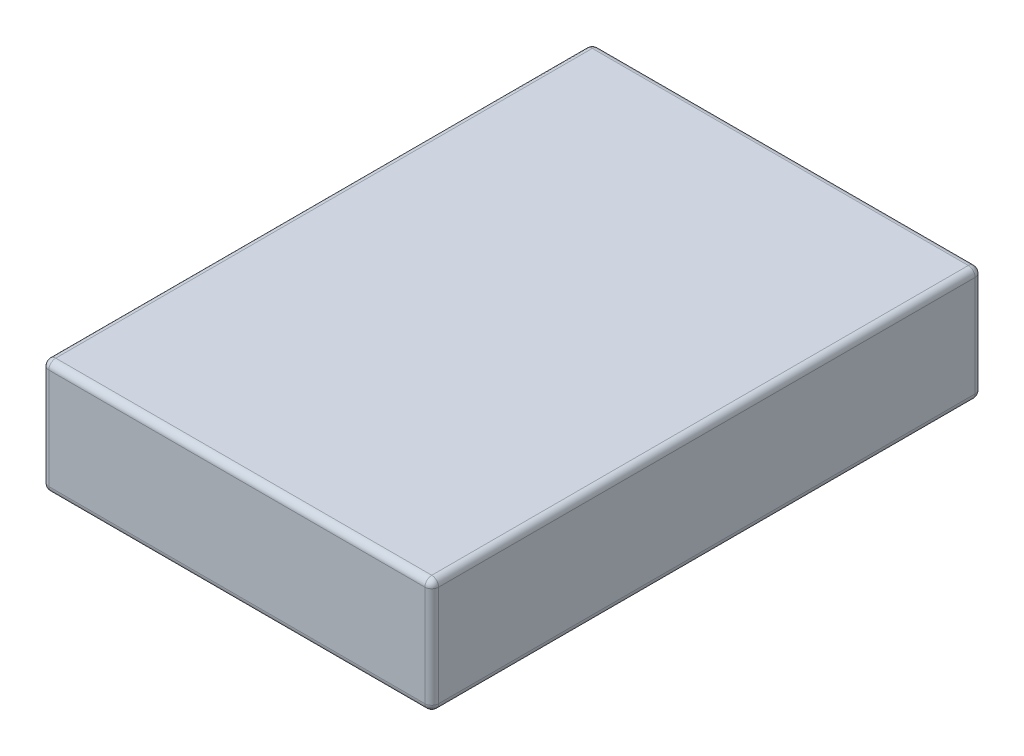
ISO-10303-21;
HEADER;
FILE_DESCRIPTION(('STEP AP214'),'2;1');
FILE_NAME('part.step','',(''),(''),'','','');
FILE_SCHEMA(('AUTOMOTIVE_DESIGN { 1 0 10303 214 1 1 1 1 }'));
ENDSEC;
DATA;
#1=APPLICATION_CONTEXT('core data for automotive mechanical design processes');
#2=APPLICATION_PROTOCOL_DEFINITION('international standard','automotive_design',2000,#1);
#3=PRODUCT_CONTEXT('',#1,'mechanical');
#4=PRODUCT('Part','Part','',(#3));
#5=PRODUCT_RELATED_PRODUCT_CATEGORY('part','',(#4));
#6=PRODUCT_DEFINITION_FORMATION('','',#4);
#7=PRODUCT_DEFINITION_CONTEXT('part definition',#1,'design');
#8=PRODUCT_DEFINITION('design','',#6,#7);
#9=PRODUCT_DEFINITION_SHAPE('','',#8);
#10=(LENGTH_UNIT() NAMED_UNIT(*) SI_UNIT(.MILLI.,.METRE.));
#11=(NAMED_UNIT(*) PLANE_ANGLE_UNIT() SI_UNIT($,.RADIAN.));
#12=(NAMED_UNIT(*) SI_UNIT($,.STERADIAN.) SOLID_ANGLE_UNIT());
#13=UNCERTAINTY_MEASURE_WITH_UNIT(LENGTH_MEASURE(1.E-05),#10,'distance_accuracy_value','');
#14=(GEOMETRIC_REPRESENTATION_CONTEXT(3) GLOBAL_UNCERTAINTY_ASSIGNED_CONTEXT((#13)) GLOBAL_UNIT_ASSIGNED_CONTEXT((#10,
#11,#12)) REPRESENTATION_CONTEXT('',''));
#15=CARTESIAN_POINT('',(0.,0.,0.));
#16=DIRECTION('',(0.,0.,1.));
#17=DIRECTION('',(1.,0.,0.));
#18=AXIS2_PLACEMENT_3D('',#15,#16,#17);
#19=CARTESIAN_POINT('',(16.4,-4.4,-23.4));
#20=DIRECTION('',(0.,-0.707106781186548,-0.707106781186548));
#21=DIRECTION('',(1.,0.,0.));
#22=AXIS2_PLACEMENT_3D('',#19,#20,#21);
#23=SPHERICAL_SURFACE('',#22,0.6);
#24=CARTESIAN_POINT('',(16.4,-4.4,-23.4));
#25=DIRECTION('',(0.,-1.,0.));
#26=DIRECTION('',(0.,0.,-1.));
#27=AXIS2_PLACEMENT_3D('',#24,#25,#26);
#28=CIRCLE('',#27,0.6);
#29=CARTESIAN_POINT('',(17.,-4.4,-23.4));
#30=VERTEX_POINT('',#29);
#31=CARTESIAN_POINT('',(16.4,-4.4,-24.));
#32=VERTEX_POINT('',#31);
#33=EDGE_CURVE('E59',#30,#32,#28,.F.);
#34=ORIENTED_EDGE('',*,*,#33,.F.);
#35=CARTESIAN_POINT('',(16.4,-4.4,-23.4));
#36=DIRECTION('',(0.,0.,-1.));
#37=DIRECTION('',(-1.,0.,0.));
#38=AXIS2_PLACEMENT_3D('',#35,#36,#37);
#39=CIRCLE('',#38,0.6);
#40=CARTESIAN_POINT('',(16.4,-5.,-23.4));
#41=VERTEX_POINT('',#40);
#42=EDGE_CURVE('E19',#41,#30,#39,.F.);
#43=ORIENTED_EDGE('',*,*,#42,.F.);
#44=CARTESIAN_POINT('',(16.4,-4.4,-23.4));
#45=DIRECTION('',(-1.,0.,0.));
#46=DIRECTION('',(0.,0.,1.));
#47=AXIS2_PLACEMENT_3D('',#44,#45,#46);
#48=CIRCLE('',#47,0.6);
#49=CARTESIAN_POINT('',(16.4,-4.82426406871193,-23.8242640687119));
#50=VERTEX_POINT('',#49);
#51=EDGE_CURVE('E34',#50,#41,#48,.T.);
#52=ORIENTED_EDGE('',*,*,#51,.F.);
#53=CARTESIAN_POINT('',(16.4,-4.4,-23.4));
#54=DIRECTION('',(-1.,0.,0.));
#55=DIRECTION('',(0.,0.,1.));
#56=AXIS2_PLACEMENT_3D('',#53,#54,#55);
#57=CIRCLE('',#56,0.6);
#58=EDGE_CURVE('E72',#32,#50,#57,.T.);
#59=ORIENTED_EDGE('',*,*,#58,.F.);
#60=EDGE_LOOP('',(#34,#43,#52,#59));
#61=FACE_BOUND('',#60,.T.);
#62=ADVANCED_FACE('F15',(#61),#23,.T.);
#63=CARTESIAN_POINT('',(-16.4,-4.4,-23.4));
#64=DIRECTION('',(-0.707106781186548,0.,-0.707106781186548));
#65=DIRECTION('',(0.,-1.,0.));
#66=AXIS2_PLACEMENT_3D('',#63,#64,#65);
#67=SPHERICAL_SURFACE('',#66,0.6);
#68=CARTESIAN_POINT('',(-16.4,-4.4,-23.4));
#69=DIRECTION('',(0.,1.,0.));
#70=DIRECTION('',(0.,0.,1.));
#71=AXIS2_PLACEMENT_3D('',#68,#69,#70);
#72=CIRCLE('',#71,0.6);
#73=CARTESIAN_POINT('',(-16.8242640687119,-4.4,-23.8242640687119));
#74=VERTEX_POINT('',#73);
#75=CARTESIAN_POINT('',(-17.,-4.4,-23.4));
#76=VERTEX_POINT('',#75);
#77=EDGE_CURVE('E163',#74,#76,#72,.T.);
#78=ORIENTED_EDGE('',*,*,#77,.F.);
#79=CARTESIAN_POINT('',(-16.4,-4.4,-23.4));
#80=DIRECTION('',(0.,1.,0.));
#81=DIRECTION('',(0.,0.,1.));
#82=AXIS2_PLACEMENT_3D('',#79,#80,#81);
#83=CIRCLE('',#82,0.6);
#84=CARTESIAN_POINT('',(-16.4,-4.4,-24.));
#85=VERTEX_POINT('',#84);
#86=EDGE_CURVE('E166',#85,#74,#83,.T.);
#87=ORIENTED_EDGE('',*,*,#86,.F.);
#88=CARTESIAN_POINT('',(-16.4,-4.4,-23.4));
#89=DIRECTION('',(-1.,0.,0.));
#90=DIRECTION('',(0.,0.,1.));
#91=AXIS2_PLACEMENT_3D('',#88,#89,#90);
#92=CIRCLE('',#91,0.6);
#93=CARTESIAN_POINT('',(-16.4,-5.,-23.4));
#94=VERTEX_POINT('',#93);
#95=EDGE_CURVE('E85',#94,#85,#92,.F.);
#96=ORIENTED_EDGE('',*,*,#95,.F.);
#97=CARTESIAN_POINT('',(-16.4,-4.4,-23.4));
#98=DIRECTION('',(0.,0.,-1.));
#99=DIRECTION('',(-1.,0.,0.));
#100=AXIS2_PLACEMENT_3D('',#97,#98,#99);
#101=CIRCLE('',#100,0.6);
#102=EDGE_CURVE('E160',#76,#94,#101,.F.);
#103=ORIENTED_EDGE('',*,*,#102,.F.);
#104=EDGE_LOOP('',(#78,#87,#96,#103));
#105=FACE_BOUND('',#104,.T.);
#106=ADVANCED_FACE('F332',(#105),#67,.T.);
#107=CARTESIAN_POINT('',(-16.4,-4.4,23.4));
#108=DIRECTION('',(-0.707106781186548,0.,0.707106781186548));
#109=DIRECTION('',(0.,-1.,0.));
#110=AXIS2_PLACEMENT_3D('',#107,#108,#109);
#111=SPHERICAL_SURFACE('',#110,0.6);
#112=CARTESIAN_POINT('',(-16.4,-4.4,23.4));
#113=DIRECTION('',(0.,0.,-1.));
#114=DIRECTION('',(-1.,0.,0.));
#115=AXIS2_PLACEMENT_3D('',#112,#113,#114);
#116=CIRCLE('',#115,0.6);
#117=CARTESIAN_POINT('',(-16.4,-5.,23.4));
#118=VERTEX_POINT('',#117);
#119=CARTESIAN_POINT('',(-17.,-4.4,23.4));
#120=VERTEX_POINT('',#119);
#121=EDGE_CURVE('E157',#118,#120,#116,.T.);
#122=ORIENTED_EDGE('',*,*,#121,.F.);
#123=CARTESIAN_POINT('',(-16.4,-4.4,23.4));
#124=DIRECTION('',(1.,0.,0.));
#125=DIRECTION('',(0.,0.,-1.));
#126=AXIS2_PLACEMENT_3D('',#123,#124,#125);
#127=CIRCLE('',#126,0.6);
#128=CARTESIAN_POINT('',(-16.4,-4.4,24.));
#129=VERTEX_POINT('',#128);
#130=EDGE_CURVE('E149',#129,#118,#127,.T.);
#131=ORIENTED_EDGE('',*,*,#130,.F.);
#132=CARTESIAN_POINT('',(-16.4,-4.4,23.4));
#133=DIRECTION('',(0.,-1.,0.));
#134=DIRECTION('',(0.,0.,-1.));
#135=AXIS2_PLACEMENT_3D('',#132,#133,#134);
#136=CIRCLE('',#135,0.6);
#137=CARTESIAN_POINT('',(-16.8242640687119,-4.4,23.8242640687119));
#138=VERTEX_POINT('',#137);
#139=EDGE_CURVE('E153',#138,#129,#136,.F.);
#140=ORIENTED_EDGE('',*,*,#139,.F.);
#141=CARTESIAN_POINT('',(-16.4,-4.4,23.4));
#142=DIRECTION('',(0.,-1.,0.));
#143=DIRECTION('',(0.,0.,-1.));
#144=AXIS2_PLACEMENT_3D('',#141,#142,#143);
#145=CIRCLE('',#144,0.6);
#146=EDGE_CURVE('E156',#120,#138,#145,.F.);
#147=ORIENTED_EDGE('',*,*,#146,.F.);
#148=EDGE_LOOP('',(#122,#131,#140,#147));
#149=FACE_BOUND('',#148,.T.);
#150=ADVANCED_FACE('F495',(#149),#111,.T.);
#151=CARTESIAN_POINT('',(-17.,-5.,-24.));
#152=DIRECTION('',(0.,-1.,0.));
#153=DIRECTION('',(0.,0.,-1.));
#154=AXIS2_PLACEMENT_3D('',#151,#152,#153);
#155=PLANE('',#154);
#156=DIRECTION('',(1.,0.,0.));
#157=VECTOR('',#156,1.);
#158=CARTESIAN_POINT('',(-17.09174313838,-5.,23.4));
#159=LINE('',#158,#157);
#160=CARTESIAN_POINT('',(16.4,-5.,23.4));
#161=VERTEX_POINT('',#160);
#162=EDGE_CURVE('E152',#118,#161,#159,.T.);
#163=ORIENTED_EDGE('',*,*,#162,.F.);
#164=DIRECTION('',(0.,0.,-1.));
#165=VECTOR('',#164,1.);
#166=CARTESIAN_POINT('',(-16.4,-5.,24.09336120841));
#167=LINE('',#166,#165);
#168=EDGE_CURVE('E81',#94,#118,#167,.F.);
#169=ORIENTED_EDGE('',*,*,#168,.F.);
#170=DIRECTION('',(-1.,0.,0.));
#171=VECTOR('',#170,1.);
#172=CARTESIAN_POINT('',(17.08821345466,-5.,-23.4));
#173=LINE('',#172,#171);
#174=EDGE_CURVE('E70',#41,#94,#173,.T.);
#175=ORIENTED_EDGE('',*,*,#174,.F.);
#176=DIRECTION('',(0.,0.,-1.));
#177=VECTOR('',#176,1.);
#178=CARTESIAN_POINT('',(16.4,-5.,24.09336120841));
#179=LINE('',#178,#177);
#180=EDGE_CURVE('E78',#161,#41,#179,.T.);
#181=ORIENTED_EDGE('',*,*,#180,.F.);
#182=EDGE_LOOP('',(#163,#169,#175,#181));
#183=FACE_BOUND('',#182,.T.);
#184=ADVANCED_FACE('F77',(#183),#155,.T.);
#185=CARTESIAN_POINT('',(16.4,-4.4,23.4));
#186=DIRECTION('',(0.,-0.707106781186548,0.707106781186548));
#187=DIRECTION('',(1.,0.,0.));
#188=AXIS2_PLACEMENT_3D('',#185,#186,#187);
#189=SPHERICAL_SURFACE('',#188,0.6);
#190=CARTESIAN_POINT('',(16.4,-4.4,23.4));
#191=DIRECTION('',(1.,0.,0.));
#192=DIRECTION('',(0.,0.,-1.));
#193=AXIS2_PLACEMENT_3D('',#190,#191,#192);
#194=CIRCLE('',#193,0.6);
#195=CARTESIAN_POINT('',(16.4,-4.82426406871193,23.8242640687119));
#196=VERTEX_POINT('',#195);
#197=EDGE_CURVE('E148',#161,#196,#194,.F.);
#198=ORIENTED_EDGE('',*,*,#197,.F.);
#199=CARTESIAN_POINT('',(16.4,-4.4,23.4));
#200=DIRECTION('',(0.,0.,-1.));
#201=DIRECTION('',(-1.,0.,0.));
#202=AXIS2_PLACEMENT_3D('',#199,#200,#201);
#203=CIRCLE('',#202,0.6);
#204=CARTESIAN_POINT('',(17.,-4.4,23.4));
#205=VERTEX_POINT('',#204);
#206=EDGE_CURVE('E64',#205,#161,#203,.T.);
#207=ORIENTED_EDGE('',*,*,#206,.F.);
#208=CARTESIAN_POINT('',(16.4,-4.4,23.4));
#209=DIRECTION('',(0.,1.,0.));
#210=DIRECTION('',(0.,0.,1.));
#211=AXIS2_PLACEMENT_3D('',#208,#209,#210);
#212=CIRCLE('',#211,0.6);
#213=CARTESIAN_POINT('',(16.4,-4.4,24.));
#214=VERTEX_POINT('',#213);
#215=EDGE_CURVE('E138',#214,#205,#212,.T.);
#216=ORIENTED_EDGE('',*,*,#215,.F.);
#217=CARTESIAN_POINT('',(16.4,-4.4,23.4));
#218=DIRECTION('',(1.,0.,0.));
#219=DIRECTION('',(0.,0.,-1.));
#220=AXIS2_PLACEMENT_3D('',#217,#218,#219);
#221=CIRCLE('',#220,0.6);
#222=EDGE_CURVE('E145',#196,#214,#221,.F.);
#223=ORIENTED_EDGE('',*,*,#222,.F.);
#224=EDGE_LOOP('',(#198,#207,#216,#223));
#225=FACE_BOUND('',#224,.T.);
#226=ADVANCED_FACE('F309',(#225),#189,.T.);
#227=CARTESIAN_POINT('',(16.4,-4.4,24.09336120841));
#228=DIRECTION('',(0.,0.,-1.));
#229=DIRECTION('',(-1.,0.,0.));
#230=AXIS2_PLACEMENT_3D('',#227,#228,#229);
#231=CYLINDRICAL_SURFACE('',#230,0.6);
#232=ORIENTED_EDGE('',*,*,#206,.T.);
#233=ORIENTED_EDGE('',*,*,#180,.T.);
#234=ORIENTED_EDGE('',*,*,#42,.T.);
#235=DIRECTION('',(0.,0.,-1.));
#236=VECTOR('',#235,1.);
#237=CARTESIAN_POINT('',(17.,-4.4,-24.));
#238=LINE('',#237,#236);
#239=EDGE_CURVE('E141',#205,#30,#238,.T.);
#240=ORIENTED_EDGE('',*,*,#239,.F.);
#241=EDGE_LOOP('',(#232,#233,#234,#240));
#242=FACE_BOUND('',#241,.T.);
#243=ADVANCED_FACE('F84',(#242),#231,.T.);
#244=CARTESIAN_POINT('',(17.08821345466,-4.4,-23.4));
#245=DIRECTION('',(-1.,0.,0.));
#246=DIRECTION('',(0.,0.,1.));
#247=AXIS2_PLACEMENT_3D('',#244,#245,#246);
#248=CYLINDRICAL_SURFACE('',#247,0.6);
#249=ORIENTED_EDGE('',*,*,#51,.T.);
#250=ORIENTED_EDGE('',*,*,#174,.T.);
#251=ORIENTED_EDGE('',*,*,#95,.T.);
#252=DIRECTION('',(1.,0.,0.));
#253=VECTOR('',#252,1.);
#254=CARTESIAN_POINT('',(0.,-4.4,-24.));
#255=LINE('',#254,#253);
#256=EDGE_CURVE('E180',#85,#32,#255,.T.);
#257=ORIENTED_EDGE('',*,*,#256,.T.);
#258=ORIENTED_EDGE('',*,*,#58,.T.);
#259=EDGE_LOOP('',(#249,#250,#251,#257,#258));
#260=FACE_BOUND('',#259,.T.);
#261=ADVANCED_FACE('F68',(#260),#248,.T.);
#262=CARTESIAN_POINT('',(16.4,5.093361208408,-23.4));
#263=DIRECTION('',(0.,-1.,0.));
#264=DIRECTION('',(0.,0.,-1.));
#265=AXIS2_PLACEMENT_3D('',#262,#263,#264);
#266=CYLINDRICAL_SURFACE('',#265,0.6);
#267=ORIENTED_EDGE('',*,*,#33,.T.);
#268=DIRECTION('',(0.,1.,0.));
#269=VECTOR('',#268,1.);
#270=CARTESIAN_POINT('',(16.4,0.,-24.));
#271=LINE('',#270,#269);
#272=CARTESIAN_POINT('',(16.4,4.4,-24.));
#273=VERTEX_POINT('',#272);
#274=EDGE_CURVE('E132',#32,#273,#271,.T.);
#275=ORIENTED_EDGE('',*,*,#274,.T.);
#276=CARTESIAN_POINT('',(16.4,4.4,-23.4));
#277=DIRECTION('',(0.,-1.,0.));
#278=DIRECTION('',(0.,0.,-1.));
#279=AXIS2_PLACEMENT_3D('',#276,#277,#278);
#280=CIRCLE('',#279,0.6);
#281=CARTESIAN_POINT('',(17.,4.4,-23.4));
#282=VERTEX_POINT('',#281);
#283=EDGE_CURVE('E133',#282,#273,#280,.F.);
#284=ORIENTED_EDGE('',*,*,#283,.F.);
#285=DIRECTION('',(0.,1.,0.));
#286=VECTOR('',#285,1.);
#287=CARTESIAN_POINT('',(17.,-5.,-23.4));
#288=LINE('',#287,#286);
#289=EDGE_CURVE('E185',#30,#282,#288,.T.);
#290=ORIENTED_EDGE('',*,*,#289,.F.);
#291=EDGE_LOOP('',(#267,#275,#284,#290));
#292=FACE_BOUND('',#291,.T.);
#293=ADVANCED_FACE('F336',(#292),#266,.T.);
#294=CARTESIAN_POINT('',(-16.4,-5.089974716722,-23.4));
#295=DIRECTION('',(0.,1.,0.));
#296=DIRECTION('',(0.,0.,1.));
#297=AXIS2_PLACEMENT_3D('',#294,#295,#296);
#298=CYLINDRICAL_SURFACE('',#297,0.6);
#299=ORIENTED_EDGE('',*,*,#77,.T.);
#300=DIRECTION('',(0.,1.,0.));
#301=VECTOR('',#300,1.);
#302=CARTESIAN_POINT('',(-17.,5.,-23.4));
#303=LINE('',#302,#301);
#304=CARTESIAN_POINT('',(-17.,4.4,-23.4));
#305=VERTEX_POINT('',#304);
#306=EDGE_CURVE('E179',#305,#76,#303,.F.);
#307=ORIENTED_EDGE('',*,*,#306,.F.);
#308=CARTESIAN_POINT('',(-16.4,4.4,-23.4));
#309=DIRECTION('',(0.,1.,0.));
#310=DIRECTION('',(0.,0.,1.));
#311=AXIS2_PLACEMENT_3D('',#308,#309,#310);
#312=CIRCLE('',#311,0.6);
#313=CARTESIAN_POINT('',(-16.4,4.4,-24.));
#314=VERTEX_POINT('',#313);
#315=EDGE_CURVE('E128',#314,#305,#312,.T.);
#316=ORIENTED_EDGE('',*,*,#315,.F.);
#317=DIRECTION('',(0.,1.,0.));
#318=VECTOR('',#317,1.);
#319=CARTESIAN_POINT('',(-16.4,0.,-24.));
#320=LINE('',#319,#318);
#321=EDGE_CURVE('E136',#314,#85,#320,.F.);
#322=ORIENTED_EDGE('',*,*,#321,.T.);
#323=ORIENTED_EDGE('',*,*,#86,.T.);
#324=EDGE_LOOP('',(#299,#307,#316,#322,#323));
#325=FACE_BOUND('',#324,.T.);
#326=ADVANCED_FACE('F331',(#325),#298,.T.);
#327=CARTESIAN_POINT('',(-16.4,-4.4,24.09336120841));
#328=DIRECTION('',(0.,0.,-1.));
#329=DIRECTION('',(-1.,0.,0.));
#330=AXIS2_PLACEMENT_3D('',#327,#328,#329);
#331=CYLINDRICAL_SURFACE('',#330,0.6);
#332=ORIENTED_EDGE('',*,*,#121,.T.);
#333=DIRECTION('',(0.,0.,1.));
#334=VECTOR('',#333,1.);
#335=CARTESIAN_POINT('',(-17.,-4.4,-24.));
#336=LINE('',#335,#334);
#337=EDGE_CURVE('E127',#76,#120,#336,.T.);
#338=ORIENTED_EDGE('',*,*,#337,.F.);
#339=ORIENTED_EDGE('',*,*,#102,.T.);
#340=ORIENTED_EDGE('',*,*,#168,.T.);
#341=EDGE_LOOP('',(#332,#338,#339,#340));
#342=FACE_BOUND('',#341,.T.);
#343=ADVANCED_FACE('F187',(#342),#331,.T.);
#344=CARTESIAN_POINT('',(-16.4,5.091743138385,23.4));
#345=DIRECTION('',(0.,-1.,0.));
#346=DIRECTION('',(0.,0.,-1.));
#347=AXIS2_PLACEMENT_3D('',#344,#345,#346);
#348=CYLINDRICAL_SURFACE('',#347,0.6);
#349=ORIENTED_EDGE('',*,*,#139,.T.);
#350=DIRECTION('',(0.,1.,0.));
#351=VECTOR('',#350,1.);
#352=CARTESIAN_POINT('',(-16.4,0.,24.));
#353=LINE('',#352,#351);
#354=CARTESIAN_POINT('',(-16.4,4.4,24.));
#355=VERTEX_POINT('',#354);
#356=EDGE_CURVE('E126',#355,#129,#353,.F.);
#357=ORIENTED_EDGE('',*,*,#356,.F.);
#358=CARTESIAN_POINT('',(-16.4,4.4,23.4));
#359=DIRECTION('',(0.,-1.,0.));
#360=DIRECTION('',(0.,0.,-1.));
#361=AXIS2_PLACEMENT_3D('',#358,#359,#360);
#362=CIRCLE('',#361,0.6);
#363=CARTESIAN_POINT('',(-17.,4.4,23.4));
#364=VERTEX_POINT('',#363);
#365=EDGE_CURVE('E123',#364,#355,#362,.F.);
#366=ORIENTED_EDGE('',*,*,#365,.F.);
#367=DIRECTION('',(0.,1.,0.));
#368=VECTOR('',#367,1.);
#369=CARTESIAN_POINT('',(-17.,5.,23.4));
#370=LINE('',#369,#368);
#371=EDGE_CURVE('E131',#120,#364,#370,.T.);
#372=ORIENTED_EDGE('',*,*,#371,.F.);
#373=ORIENTED_EDGE('',*,*,#146,.T.);
#374=EDGE_LOOP('',(#349,#357,#366,#372,#373));
#375=FACE_BOUND('',#374,.T.);
#376=ADVANCED_FACE('F445',(#375),#348,.T.);
#377=CARTESIAN_POINT('',(-17.09174313838,-4.4,23.4));
#378=DIRECTION('',(1.,0.,0.));
#379=DIRECTION('',(0.,0.,-1.));
#380=AXIS2_PLACEMENT_3D('',#377,#378,#379);
#381=CYLINDRICAL_SURFACE('',#380,0.6);
#382=ORIENTED_EDGE('',*,*,#222,.T.);
#383=DIRECTION('',(1.,0.,0.));
#384=VECTOR('',#383,1.);
#385=CARTESIAN_POINT('',(0.,-4.4,24.));
#386=LINE('',#385,#384);
#387=EDGE_CURVE('E303',#129,#214,#386,.T.);
#388=ORIENTED_EDGE('',*,*,#387,.F.);
#389=ORIENTED_EDGE('',*,*,#130,.T.);
#390=ORIENTED_EDGE('',*,*,#162,.T.);
#391=ORIENTED_EDGE('',*,*,#197,.T.);
#392=EDGE_LOOP('',(#382,#388,#389,#390,#391));
#393=FACE_BOUND('',#392,.T.);
#394=ADVANCED_FACE('F307',(#393),#381,.T.);
#395=CARTESIAN_POINT('',(16.4,-5.089974716722,23.4));
#396=DIRECTION('',(0.,1.,0.));
#397=DIRECTION('',(0.,0.,1.));
#398=AXIS2_PLACEMENT_3D('',#395,#396,#397);
#399=CYLINDRICAL_SURFACE('',#398,0.6);
#400=ORIENTED_EDGE('',*,*,#215,.T.);
#401=DIRECTION('',(0.,1.,0.));
#402=VECTOR('',#401,1.);
#403=CARTESIAN_POINT('',(17.,-5.,23.4));
#404=LINE('',#403,#402);
#405=CARTESIAN_POINT('',(17.,4.4,23.4));
#406=VERTEX_POINT('',#405);
#407=EDGE_CURVE('E137',#406,#205,#404,.F.);
#408=ORIENTED_EDGE('',*,*,#407,.F.);
#409=CARTESIAN_POINT('',(16.4,4.4,23.4));
#410=DIRECTION('',(0.,1.,0.));
#411=DIRECTION('',(0.,0.,1.));
#412=AXIS2_PLACEMENT_3D('',#409,#410,#411);
#413=CIRCLE('',#412,0.6);
#414=CARTESIAN_POINT('',(16.4,4.4,24.));
#415=VERTEX_POINT('',#414);
#416=EDGE_CURVE('E142',#406,#415,#413,.F.);
#417=ORIENTED_EDGE('',*,*,#416,.T.);
#418=DIRECTION('',(0.,1.,0.));
#419=VECTOR('',#418,1.);
#420=CARTESIAN_POINT('',(16.4,0.,24.));
#421=LINE('',#420,#419);
#422=EDGE_CURVE('E305',#214,#415,#421,.T.);
#423=ORIENTED_EDGE('',*,*,#422,.F.);
#424=EDGE_LOOP('',(#400,#408,#417,#423));
#425=FACE_BOUND('',#424,.T.);
#426=ADVANCED_FACE('F311',(#425),#399,.T.);
#427=CARTESIAN_POINT('',(17.,-5.,-24.));
#428=DIRECTION('',(1.,0.,0.));
#429=DIRECTION('',(0.,0.,-1.));
#430=AXIS2_PLACEMENT_3D('',#427,#428,#429);
#431=PLANE('',#430);
#432=DIRECTION('',(0.,0.,-1.));
#433=VECTOR('',#432,1.);
#434=CARTESIAN_POINT('',(17.,4.4,24.09336120841));
#435=LINE('',#434,#433);
#436=EDGE_CURVE('E118',#406,#282,#435,.T.);
#437=ORIENTED_EDGE('',*,*,#436,.F.);
#438=ORIENTED_EDGE('',*,*,#407,.T.);
#439=ORIENTED_EDGE('',*,*,#239,.T.);
#440=ORIENTED_EDGE('',*,*,#289,.T.);
#441=EDGE_LOOP('',(#437,#438,#439,#440));
#442=FACE_BOUND('',#441,.T.);
#443=ADVANCED_FACE('F313',(#442),#431,.T.);
#444=CARTESIAN_POINT('',(16.4,4.4,-23.4));
#445=DIRECTION('',(0.,0.707106781186498,-0.707106781186598));
#446=DIRECTION('',(1.,0.,0.));
#447=AXIS2_PLACEMENT_3D('',#444,#445,#446);
#448=SPHERICAL_SURFACE('',#447,0.6);
#449=CARTESIAN_POINT('',(16.4,4.4,-23.4));
#450=DIRECTION('',(0.,0.,-1.));
#451=DIRECTION('',(-1.,0.,0.));
#452=AXIS2_PLACEMENT_3D('',#449,#450,#451);
#453=CIRCLE('',#452,0.6);
#454=CARTESIAN_POINT('',(16.4,5.,-23.4));
#455=VERTEX_POINT('',#454);
#456=EDGE_CURVE('E115',#282,#455,#453,.F.);
#457=ORIENTED_EDGE('',*,*,#456,.F.);
#458=ORIENTED_EDGE('',*,*,#283,.T.);
#459=CARTESIAN_POINT('',(16.4,4.4,-23.4));
#460=DIRECTION('',(1.,0.,0.));
#461=DIRECTION('',(0.,0.,-1.));
#462=AXIS2_PLACEMENT_3D('',#459,#460,#461);
#463=CIRCLE('',#462,0.6);
#464=CARTESIAN_POINT('',(16.4,4.8242640687119,-23.824264068712));
#465=VERTEX_POINT('',#464);
#466=EDGE_CURVE('E107',#465,#273,#463,.F.);
#467=ORIENTED_EDGE('',*,*,#466,.F.);
#468=CARTESIAN_POINT('',(16.4,4.4,-23.4));
#469=DIRECTION('',(1.,0.,0.));
#470=DIRECTION('',(0.,0.,-1.));
#471=AXIS2_PLACEMENT_3D('',#468,#469,#470);
#472=CIRCLE('',#471,0.6);
#473=EDGE_CURVE('E111',#455,#465,#472,.F.);
#474=ORIENTED_EDGE('',*,*,#473,.F.);
#475=EDGE_LOOP('',(#457,#458,#467,#474));
#476=FACE_BOUND('',#475,.T.);
#477=ADVANCED_FACE('F338',(#476),#448,.T.);
#478=CARTESIAN_POINT('',(0.,0.,-24.));
#479=DIRECTION('',(0.,0.,1.));
#480=DIRECTION('',(1.,0.,0.));
#481=AXIS2_PLACEMENT_3D('',#478,#479,#480);
#482=PLANE('',#481);
#483=ORIENTED_EDGE('',*,*,#256,.F.);
#484=ORIENTED_EDGE('',*,*,#321,.F.);
#485=DIRECTION('',(1.,0.,0.));
#486=VECTOR('',#485,1.);
#487=CARTESIAN_POINT('',(-17.09616777234,4.4,-24.));
#488=LINE('',#487,#486);
#489=EDGE_CURVE('E110',#273,#314,#488,.F.);
#490=ORIENTED_EDGE('',*,*,#489,.F.);
#491=ORIENTED_EDGE('',*,*,#274,.F.);
#492=EDGE_LOOP('',(#483,#484,#490,#491));
#493=FACE_BOUND('',#492,.T.);
#494=ADVANCED_FACE('F335',(#493),#482,.F.);
#495=CARTESIAN_POINT('',(-16.4,4.4,-23.4));
#496=DIRECTION('',(-0.707106781186548,0.707106781186548,0.));
#497=DIRECTION('',(0.,0.,-1.));
#498=AXIS2_PLACEMENT_3D('',#495,#496,#497);
#499=SPHERICAL_SURFACE('',#498,0.6);
#500=CARTESIAN_POINT('',(-16.4,4.4,-23.4));
#501=DIRECTION('',(0.,0.,-1.));
#502=DIRECTION('',(-1.,0.,0.));
#503=AXIS2_PLACEMENT_3D('',#500,#501,#502);
#504=CIRCLE('',#503,0.6);
#505=CARTESIAN_POINT('',(-16.8242640687119,4.82426406871193,-23.4));
#506=VERTEX_POINT('',#505);
#507=EDGE_CURVE('E102',#506,#305,#504,.F.);
#508=ORIENTED_EDGE('',*,*,#507,.F.);
#509=CARTESIAN_POINT('',(-16.4,4.4,-23.4));
#510=DIRECTION('',(0.,0.,-1.));
#511=DIRECTION('',(-1.,0.,0.));
#512=AXIS2_PLACEMENT_3D('',#509,#510,#511);
#513=CIRCLE('',#512,0.6);
#514=CARTESIAN_POINT('',(-16.4,5.,-23.4));
#515=VERTEX_POINT('',#514);
#516=EDGE_CURVE('E106',#515,#506,#513,.F.);
#517=ORIENTED_EDGE('',*,*,#516,.F.);
#518=CARTESIAN_POINT('',(-16.4,4.4,-23.4));
#519=DIRECTION('',(1.,0.,0.));
#520=DIRECTION('',(0.,0.,-1.));
#521=AXIS2_PLACEMENT_3D('',#518,#519,#520);
#522=CIRCLE('',#521,0.6);
#523=EDGE_CURVE('E112',#314,#515,#522,.T.);
#524=ORIENTED_EDGE('',*,*,#523,.F.);
#525=ORIENTED_EDGE('',*,*,#315,.T.);
#526=EDGE_LOOP('',(#508,#517,#524,#525));
#527=FACE_BOUND('',#526,.T.);
#528=ADVANCED_FACE('F270',(#527),#499,.T.);
#529=CARTESIAN_POINT('',(-17.,5.,-24.));
#530=DIRECTION('',(-1.,0.,0.));
#531=DIRECTION('',(0.,0.,1.));
#532=AXIS2_PLACEMENT_3D('',#529,#530,#531);
#533=PLANE('',#532);
#534=ORIENTED_EDGE('',*,*,#306,.T.);
#535=ORIENTED_EDGE('',*,*,#337,.T.);
#536=ORIENTED_EDGE('',*,*,#371,.T.);
#537=DIRECTION('',(0.,0.,-1.));
#538=VECTOR('',#537,1.);
#539=CARTESIAN_POINT('',(-17.,4.4,24.09336120841));
#540=LINE('',#539,#538);
#541=EDGE_CURVE('E105',#305,#364,#540,.F.);
#542=ORIENTED_EDGE('',*,*,#541,.F.);
#543=EDGE_LOOP('',(#534,#535,#536,#542));
#544=FACE_BOUND('',#543,.T.);
#545=ADVANCED_FACE('F330',(#544),#533,.T.);
#546=CARTESIAN_POINT('',(-16.4,4.4,23.4));
#547=DIRECTION('',(-0.707106781186548,0.707106781186548,0.));
#548=DIRECTION('',(0.,0.,1.));
#549=AXIS2_PLACEMENT_3D('',#546,#547,#548);
#550=SPHERICAL_SURFACE('',#549,0.6);
#551=CARTESIAN_POINT('',(-16.4,4.4,23.4));
#552=DIRECTION('',(0.,0.,-1.));
#553=DIRECTION('',(-1.,0.,0.));
#554=AXIS2_PLACEMENT_3D('',#551,#552,#553);
#555=CIRCLE('',#554,0.6);
#556=CARTESIAN_POINT('',(-16.8242640687119,4.82426406871193,23.4));
#557=VERTEX_POINT('',#556);
#558=EDGE_CURVE('E101',#364,#557,#555,.T.);
#559=ORIENTED_EDGE('',*,*,#558,.F.);
#560=ORIENTED_EDGE('',*,*,#365,.T.);
#561=CARTESIAN_POINT('',(-16.4,4.4,23.4));
#562=DIRECTION('',(-1.,0.,0.));
#563=DIRECTION('',(0.,0.,1.));
#564=AXIS2_PLACEMENT_3D('',#561,#562,#563);
#565=CIRCLE('',#564,0.6);
#566=CARTESIAN_POINT('',(-16.4,5.,23.4));
#567=VERTEX_POINT('',#566);
#568=EDGE_CURVE('E95',#567,#355,#565,.F.);
#569=ORIENTED_EDGE('',*,*,#568,.F.);
#570=CARTESIAN_POINT('',(-16.4,4.4,23.4));
#571=DIRECTION('',(0.,0.,-1.));
#572=DIRECTION('',(-1.,0.,0.));
#573=AXIS2_PLACEMENT_3D('',#570,#571,#572);
#574=CIRCLE('',#573,0.6);
#575=EDGE_CURVE('E98',#557,#567,#574,.T.);
#576=ORIENTED_EDGE('',*,*,#575,.F.);
#577=EDGE_LOOP('',(#559,#560,#569,#576));
#578=FACE_BOUND('',#577,.T.);
#579=ADVANCED_FACE('F359',(#578),#550,.T.);
#580=CARTESIAN_POINT('',(0.,0.,24.));
#581=DIRECTION('',(0.,0.,1.));
#582=DIRECTION('',(1.,0.,0.));
#583=AXIS2_PLACEMENT_3D('',#580,#581,#582);
#584=PLANE('',#583);
#585=ORIENTED_EDGE('',*,*,#422,.T.);
#586=DIRECTION('',(-1.,0.,0.));
#587=VECTOR('',#586,1.);
#588=CARTESIAN_POINT('',(17.08821345466,4.4,24.));
#589=LINE('',#588,#587);
#590=EDGE_CURVE('E94',#355,#415,#589,.F.);
#591=ORIENTED_EDGE('',*,*,#590,.F.);
#592=ORIENTED_EDGE('',*,*,#356,.T.);
#593=ORIENTED_EDGE('',*,*,#387,.T.);
#594=EDGE_LOOP('',(#585,#591,#592,#593));
#595=FACE_BOUND('',#594,.T.);
#596=ADVANCED_FACE('F348',(#595),#584,.T.);
#597=CARTESIAN_POINT('',(16.4,4.4,23.4));
#598=DIRECTION('',(0.707106781186548,0.707106781186548,0.));
#599=DIRECTION('',(0.,0.,1.));
#600=AXIS2_PLACEMENT_3D('',#597,#598,#599);
#601=SPHERICAL_SURFACE('',#600,0.6);
#602=CARTESIAN_POINT('',(16.4,4.4,23.4));
#603=DIRECTION('',(0.,0.,-1.));
#604=DIRECTION('',(-1.,0.,0.));
#605=AXIS2_PLACEMENT_3D('',#602,#603,#604);
#606=CIRCLE('',#605,0.6);
#607=CARTESIAN_POINT('',(16.8242640687119,4.82426406871193,23.4));
#608=VERTEX_POINT('',#607);
#609=EDGE_CURVE('E119',#608,#406,#606,.T.);
#610=ORIENTED_EDGE('',*,*,#609,.F.);
#611=CARTESIAN_POINT('',(16.4,4.4,23.4));
#612=DIRECTION('',(0.,0.,-1.));
#613=DIRECTION('',(-1.,0.,0.));
#614=AXIS2_PLACEMENT_3D('',#611,#612,#613);
#615=CIRCLE('',#614,0.6);
#616=CARTESIAN_POINT('',(16.4,5.,23.4));
#617=VERTEX_POINT('',#616);
#618=EDGE_CURVE('E122',#617,#608,#615,.T.);
#619=ORIENTED_EDGE('',*,*,#618,.F.);
#620=CARTESIAN_POINT('',(16.4,4.4,23.4));
#621=DIRECTION('',(-1.,0.,0.));
#622=DIRECTION('',(0.,0.,1.));
#623=AXIS2_PLACEMENT_3D('',#620,#621,#622);
#624=CIRCLE('',#623,0.6);
#625=EDGE_CURVE('E90',#415,#617,#624,.T.);
#626=ORIENTED_EDGE('',*,*,#625,.F.);
#627=ORIENTED_EDGE('',*,*,#416,.F.);
#628=EDGE_LOOP('',(#610,#619,#626,#627));
#629=FACE_BOUND('',#628,.T.);
#630=ADVANCED_FACE('F349',(#629),#601,.T.);
#631=CARTESIAN_POINT('',(16.4,4.4,24.09336120841));
#632=DIRECTION('',(0.,0.,-1.));
#633=DIRECTION('',(-1.,0.,0.));
#634=AXIS2_PLACEMENT_3D('',#631,#632,#633);
#635=CYLINDRICAL_SURFACE('',#634,0.6);
#636=ORIENTED_EDGE('',*,*,#456,.T.);
#637=DIRECTION('',(0.,0.,1.));
#638=VECTOR('',#637,1.);
#639=CARTESIAN_POINT('',(16.4,5.,-24.));
#640=LINE('',#639,#638);
#641=EDGE_CURVE('E93',#617,#455,#640,.F.);
#642=ORIENTED_EDGE('',*,*,#641,.F.);
#643=ORIENTED_EDGE('',*,*,#618,.T.);
#644=ORIENTED_EDGE('',*,*,#609,.T.);
#645=ORIENTED_EDGE('',*,*,#436,.T.);
#646=EDGE_LOOP('',(#636,#642,#643,#644,#645));
#647=FACE_BOUND('',#646,.T.);
#648=ADVANCED_FACE('F316',(#647),#635,.T.);
#649=CARTESIAN_POINT('',(-17.09616777234,4.4,-23.4));
#650=DIRECTION('',(1.,0.,0.));
#651=DIRECTION('',(0.,0.,-1.));
#652=AXIS2_PLACEMENT_3D('',#649,#650,#651);
#653=CYLINDRICAL_SURFACE('',#652,0.6);
#654=ORIENTED_EDGE('',*,*,#466,.T.);
#655=ORIENTED_EDGE('',*,*,#489,.T.);
#656=ORIENTED_EDGE('',*,*,#523,.T.);
#657=DIRECTION('',(1.,0.,0.));
#658=VECTOR('',#657,1.);
#659=CARTESIAN_POINT('',(17.,5.,-23.4));
#660=LINE('',#659,#658);
#661=EDGE_CURVE('E281',#455,#515,#660,.F.);
#662=ORIENTED_EDGE('',*,*,#661,.F.);
#663=ORIENTED_EDGE('',*,*,#473,.T.);
#664=EDGE_LOOP('',(#654,#655,#656,#662,#663));
#665=FACE_BOUND('',#664,.T.);
#666=ADVANCED_FACE('F278',(#665),#653,.T.);
#667=CARTESIAN_POINT('',(-16.4,4.4,24.09336120841));
#668=DIRECTION('',(0.,0.,-1.));
#669=DIRECTION('',(-1.,0.,0.));
#670=AXIS2_PLACEMENT_3D('',#667,#668,#669);
#671=CYLINDRICAL_SURFACE('',#670,0.6);
#672=ORIENTED_EDGE('',*,*,#575,.T.);
#673=DIRECTION('',(0.,0.,1.));
#674=VECTOR('',#673,1.);
#675=CARTESIAN_POINT('',(-16.4,5.,-24.));
#676=LINE('',#675,#674);
#677=EDGE_CURVE('E25',#515,#567,#676,.T.);
#678=ORIENTED_EDGE('',*,*,#677,.F.);
#679=ORIENTED_EDGE('',*,*,#516,.T.);
#680=ORIENTED_EDGE('',*,*,#507,.T.);
#681=ORIENTED_EDGE('',*,*,#541,.T.);
#682=ORIENTED_EDGE('',*,*,#558,.T.);
#683=EDGE_LOOP('',(#672,#678,#679,#680,#681,#682));
#684=FACE_BOUND('',#683,.T.);
#685=ADVANCED_FACE('F285',(#684),#671,.T.);
#686=CARTESIAN_POINT('',(17.08821345466,4.4,23.4));
#687=DIRECTION('',(-1.,0.,0.));
#688=DIRECTION('',(0.,0.,1.));
#689=AXIS2_PLACEMENT_3D('',#686,#687,#688);
#690=CYLINDRICAL_SURFACE('',#689,0.6);
#691=ORIENTED_EDGE('',*,*,#625,.T.);
#692=DIRECTION('',(1.,0.,0.));
#693=VECTOR('',#692,1.);
#694=CARTESIAN_POINT('',(17.,5.,23.4));
#695=LINE('',#694,#693);
#696=EDGE_CURVE('E10',#567,#617,#695,.T.);
#697=ORIENTED_EDGE('',*,*,#696,.F.);
#698=ORIENTED_EDGE('',*,*,#568,.T.);
#699=ORIENTED_EDGE('',*,*,#590,.T.);
#700=EDGE_LOOP('',(#691,#697,#698,#699));
#701=FACE_BOUND('',#700,.T.);
#702=ADVANCED_FACE('F346',(#701),#690,.T.);
#703=CARTESIAN_POINT('',(17.,5.,-24.));
#704=DIRECTION('',(0.,1.,0.));
#705=DIRECTION('',(0.,0.,1.));
#706=AXIS2_PLACEMENT_3D('',#703,#704,#705);
#707=PLANE('',#706);
#708=ORIENTED_EDGE('',*,*,#677,.T.);
#709=ORIENTED_EDGE('',*,*,#696,.T.);
#710=ORIENTED_EDGE('',*,*,#641,.T.);
#711=ORIENTED_EDGE('',*,*,#661,.T.);
#712=EDGE_LOOP('',(#708,#709,#710,#711));
#713=FACE_BOUND('',#712,.T.);
#714=ADVANCED_FACE('F17',(#713),#707,.T.);
#715=CLOSED_SHELL('',(#62,#106,#150,#184,#226,#243,#261,#293,#326,#343,#376,#394,#426,#443,#477,
#494,#528,#545,#579,#596,#630,#648,#666,#685,#702,#714));
#716=MANIFOLD_SOLID_BREP('B1',#715);
#717=ADVANCED_BREP_SHAPE_REPRESENTATION('',(#18,#716),#14);
#718=SHAPE_DEFINITION_REPRESENTATION(#9,#717);
ENDSEC;
END-ISO-10303-21;
